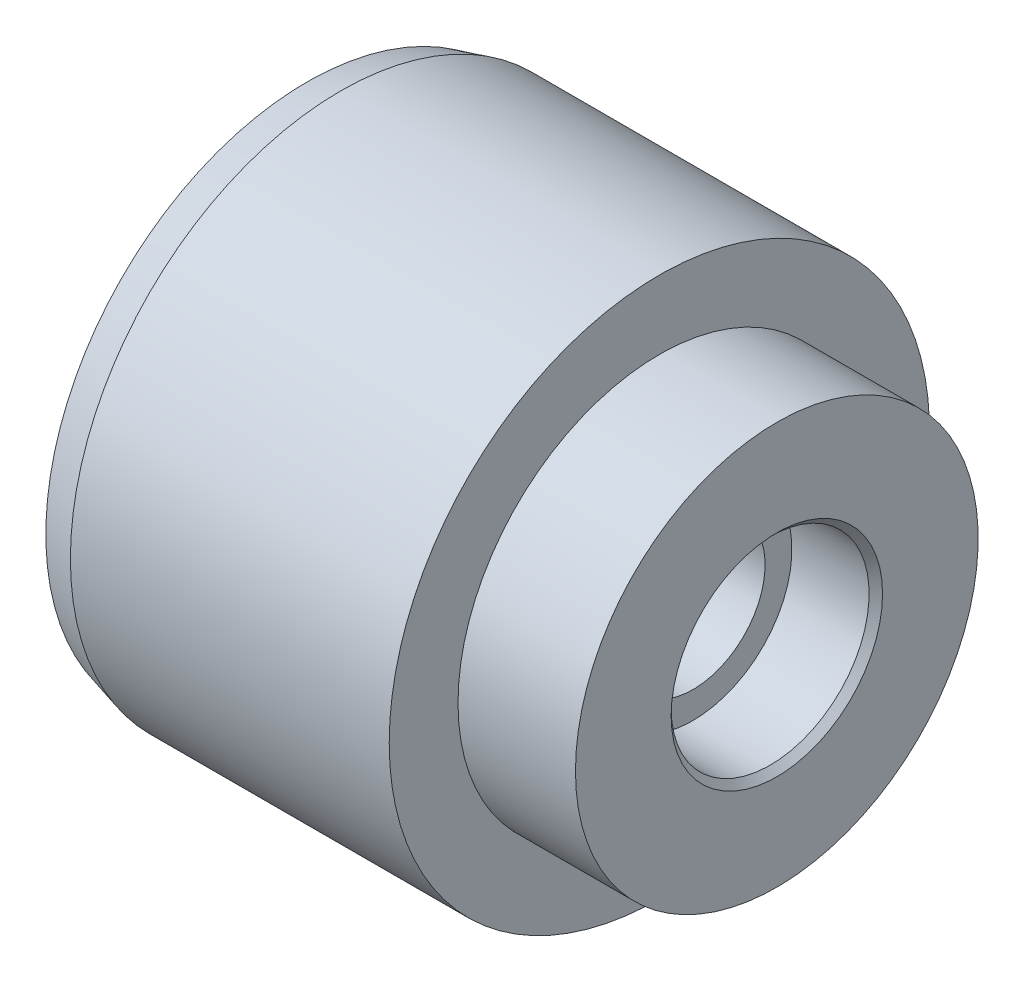
ISO-10303-21;
HEADER;
FILE_DESCRIPTION(('STEP AP214'),'2;1');
FILE_NAME('part.step','',(''),(''),'','','');
FILE_SCHEMA(('AUTOMOTIVE_DESIGN { 1 0 10303 214 1 1 1 1 }'));
ENDSEC;
DATA;
#1=APPLICATION_CONTEXT('core data for automotive mechanical design processes');
#2=APPLICATION_PROTOCOL_DEFINITION('international standard','automotive_design',2000,#1);
#3=PRODUCT_CONTEXT('',#1,'mechanical');
#4=PRODUCT('Part','Part','',(#3));
#5=PRODUCT_RELATED_PRODUCT_CATEGORY('part','',(#4));
#6=PRODUCT_DEFINITION_FORMATION('','',#4);
#7=PRODUCT_DEFINITION_CONTEXT('part definition',#1,'design');
#8=PRODUCT_DEFINITION('design','',#6,#7);
#9=PRODUCT_DEFINITION_SHAPE('','',#8);
#10=(LENGTH_UNIT() NAMED_UNIT(*) SI_UNIT(.MILLI.,.METRE.));
#11=(NAMED_UNIT(*) PLANE_ANGLE_UNIT() SI_UNIT($,.RADIAN.));
#12=(NAMED_UNIT(*) SI_UNIT($,.STERADIAN.) SOLID_ANGLE_UNIT());
#13=UNCERTAINTY_MEASURE_WITH_UNIT(LENGTH_MEASURE(1.E-05),#10,'distance_accuracy_value','');
#14=(GEOMETRIC_REPRESENTATION_CONTEXT(3) GLOBAL_UNCERTAINTY_ASSIGNED_CONTEXT((#13)) GLOBAL_UNIT_ASSIGNED_CONTEXT((#10,
#11,#12)) REPRESENTATION_CONTEXT('',''));
#15=CARTESIAN_POINT('',(0.,0.,0.));
#16=DIRECTION('',(0.,0.,1.));
#17=DIRECTION('',(1.,0.,0.));
#18=AXIS2_PLACEMENT_3D('',#15,#16,#17);
#19=CARTESIAN_POINT('',(0.,0.,0.));
#20=DIRECTION('',(1.,0.,0.));
#21=DIRECTION('',(0.,0.,-1.));
#22=AXIS2_PLACEMENT_3D('',#19,#20,#21);
#23=PLANE('',#22);
#24=CARTESIAN_POINT('',(0.,0.,0.));
#25=DIRECTION('',(-1.,0.,0.));
#26=DIRECTION('',(0.,0.,1.));
#27=AXIS2_PLACEMENT_3D('',#24,#25,#26);
#28=CIRCLE('',#27,2.15);
#29=CARTESIAN_POINT('',(0.,0.,2.15000000000001));
#30=VERTEX_POINT('',#29);
#31=EDGE_CURVE('E102',#30,#30,#28,.T.);
#32=ORIENTED_EDGE('',*,*,#31,.F.);
#33=EDGE_LOOP('',(#32));
#34=FACE_BOUND('',#33,.T.);
#35=CARTESIAN_POINT('',(0.,0.,0.));
#36=DIRECTION('',(1.,0.,0.));
#37=DIRECTION('',(0.,0.,-1.));
#38=AXIS2_PLACEMENT_3D('',#35,#36,#37);
#39=CIRCLE('',#38,7.78205080756886);
#40=CARTESIAN_POINT('',(0.,0.,-7.7820508075689));
#41=VERTEX_POINT('',#40);
#42=EDGE_CURVE('E71',#41,#41,#39,.F.);
#43=ORIENTED_EDGE('',*,*,#42,.T.);
#44=EDGE_LOOP('',(#43));
#45=FACE_BOUND('',#44,.T.);
#46=ADVANCED_FACE('F47',(#34,#45),#23,.F.);
#47=CARTESIAN_POINT('',(-5.88192419825073,0.,0.));
#48=DIRECTION('',(-1.,0.,0.));
#49=DIRECTION('',(0.,0.,1.));
#50=AXIS2_PLACEMENT_3D('',#47,#48,#49);
#51=CYLINDRICAL_SURFACE('',#50,8.05);
#52=CARTESIAN_POINT('',(1.00000000000011,0.,0.));
#53=DIRECTION('',(1.,0.,0.));
#54=DIRECTION('',(0.,0.,-1.));
#55=AXIS2_PLACEMENT_3D('',#52,#53,#54);
#56=CIRCLE('',#55,8.05);
#57=CARTESIAN_POINT('',(1.00000000000011,0.,-8.05000000000004));
#58=VERTEX_POINT('',#57);
#59=EDGE_CURVE('E64',#58,#58,#56,.T.);
#60=ORIENTED_EDGE('',*,*,#59,.T.);
#61=EDGE_LOOP('',(#60));
#62=FACE_BOUND('',#61,.T.);
#63=CARTESIAN_POINT('',(10.5,0.,2.77555756156289E-13));
#64=DIRECTION('',(-1.,0.,0.));
#65=DIRECTION('',(0.,0.,1.));
#66=AXIS2_PLACEMENT_3D('',#63,#64,#65);
#67=CIRCLE('',#66,8.05);
#68=CARTESIAN_POINT('',(10.5,0.,8.05000000000031));
#69=VERTEX_POINT('',#68);
#70=EDGE_CURVE('E93',#69,#69,#67,.T.);
#71=ORIENTED_EDGE('',*,*,#70,.T.);
#72=EDGE_LOOP('',(#71));
#73=FACE_BOUND('',#72,.T.);
#74=ADVANCED_FACE('F115',(#62,#73),#51,.T.);
#75=CARTESIAN_POINT('',(10.5,8.04999999999985,0.));
#76=DIRECTION('',(-1.,0.,0.));
#77=DIRECTION('',(0.,0.,1.));
#78=AXIS2_PLACEMENT_3D('',#75,#76,#77);
#79=PLANE('',#78);
#80=ORIENTED_EDGE('',*,*,#70,.F.);
#81=EDGE_LOOP('',(#80));
#82=FACE_BOUND('',#81,.T.);
#83=CARTESIAN_POINT('',(10.5,0.,2.77555756156289E-13));
#84=DIRECTION('',(-1.,0.,0.));
#85=DIRECTION('',(0.,0.,1.));
#86=AXIS2_PLACEMENT_3D('',#83,#84,#85);
#87=CIRCLE('',#86,6.);
#88=CARTESIAN_POINT('',(10.5,0.,6.0000000000003));
#89=VERTEX_POINT('',#88);
#90=EDGE_CURVE('E86',#89,#89,#87,.T.);
#91=ORIENTED_EDGE('',*,*,#90,.T.);
#92=EDGE_LOOP('',(#91));
#93=FACE_BOUND('',#92,.T.);
#94=ADVANCED_FACE('F160',(#82,#93),#79,.F.);
#95=CARTESIAN_POINT('',(-5.88192419825073,0.,0.));
#96=DIRECTION('',(-1.,0.,0.));
#97=DIRECTION('',(0.,0.,1.));
#98=AXIS2_PLACEMENT_3D('',#95,#96,#97);
#99=CYLINDRICAL_SURFACE('',#98,6.);
#100=ORIENTED_EDGE('',*,*,#90,.F.);
#101=EDGE_LOOP('',(#100));
#102=FACE_BOUND('',#101,.T.);
#103=CARTESIAN_POINT('',(14.,0.,2.77555756156289E-13));
#104=DIRECTION('',(-1.,0.,0.));
#105=DIRECTION('',(0.,0.,1.));
#106=AXIS2_PLACEMENT_3D('',#103,#104,#105);
#107=CIRCLE('',#106,6.);
#108=CARTESIAN_POINT('',(14.,0.,6.0000000000003));
#109=VERTEX_POINT('',#108);
#110=EDGE_CURVE('E81',#109,#109,#107,.T.);
#111=ORIENTED_EDGE('',*,*,#110,.T.);
#112=EDGE_LOOP('',(#111));
#113=FACE_BOUND('',#112,.T.);
#114=ADVANCED_FACE('F157',(#102,#113),#99,.T.);
#115=CARTESIAN_POINT('',(14.,2.95000000000001,0.));
#116=DIRECTION('',(-1.,0.,0.));
#117=DIRECTION('',(0.,0.,1.));
#118=AXIS2_PLACEMENT_3D('',#115,#116,#117);
#119=PLANE('',#118);
#120=CARTESIAN_POINT('',(14.,0.,2.77555756156289E-13));
#121=DIRECTION('',(-1.,0.,0.));
#122=DIRECTION('',(0.,0.,1.));
#123=AXIS2_PLACEMENT_3D('',#120,#121,#122);
#124=CIRCLE('',#123,3.15);
#125=CARTESIAN_POINT('',(14.,0.,3.1500000000003));
#126=VERTEX_POINT('',#125);
#127=EDGE_CURVE('E56',#126,#126,#124,.T.);
#128=ORIENTED_EDGE('',*,*,#127,.T.);
#129=EDGE_LOOP('',(#128));
#130=FACE_BOUND('',#129,.T.);
#131=ORIENTED_EDGE('',*,*,#110,.F.);
#132=EDGE_LOOP('',(#131));
#133=FACE_BOUND('',#132,.T.);
#134=ADVANCED_FACE('F143',(#130,#133),#119,.F.);
#135=CARTESIAN_POINT('',(-5.88192419825073,0.,0.));
#136=DIRECTION('',(-1.,0.,0.));
#137=DIRECTION('',(0.,0.,1.));
#138=AXIS2_PLACEMENT_3D('',#135,#136,#137);
#139=CYLINDRICAL_SURFACE('',#138,2.95);
#140=CARTESIAN_POINT('',(13.8,0.,2.77555756156289E-13));
#141=DIRECTION('',(-1.,0.,0.));
#142=DIRECTION('',(0.,0.,1.));
#143=AXIS2_PLACEMENT_3D('',#140,#141,#142);
#144=CIRCLE('',#143,2.95);
#145=CARTESIAN_POINT('',(13.8,0.,2.95000000000029));
#146=VERTEX_POINT('',#145);
#147=EDGE_CURVE('E11',#146,#146,#144,.F.);
#148=ORIENTED_EDGE('',*,*,#147,.T.);
#149=EDGE_LOOP('',(#148));
#150=FACE_BOUND('',#149,.T.);
#151=CARTESIAN_POINT('',(11.5,0.,2.77555756156289E-13));
#152=DIRECTION('',(-1.,0.,0.));
#153=DIRECTION('',(0.,0.,1.));
#154=AXIS2_PLACEMENT_3D('',#151,#152,#153);
#155=CIRCLE('',#154,2.95);
#156=CARTESIAN_POINT('',(11.5,0.,2.95000000000029));
#157=VERTEX_POINT('',#156);
#158=EDGE_CURVE('E87',#157,#157,#155,.T.);
#159=ORIENTED_EDGE('',*,*,#158,.T.);
#160=EDGE_LOOP('',(#159));
#161=FACE_BOUND('',#160,.T.);
#162=ADVANCED_FACE('F131',(#150,#161),#139,.F.);
#163=CARTESIAN_POINT('',(11.5,2.94999999999999,0.));
#164=DIRECTION('',(-1.,0.,0.));
#165=DIRECTION('',(0.,0.,1.));
#166=AXIS2_PLACEMENT_3D('',#163,#164,#165);
#167=PLANE('',#166);
#168=CARTESIAN_POINT('',(11.5,0.,2.77555756156289E-13));
#169=DIRECTION('',(-1.,0.,0.));
#170=DIRECTION('',(0.,0.,1.));
#171=AXIS2_PLACEMENT_3D('',#168,#169,#170);
#172=CIRCLE('',#171,2.15);
#173=CARTESIAN_POINT('',(11.5,0.,2.15000000000028));
#174=VERTEX_POINT('',#173);
#175=EDGE_CURVE('E99',#174,#174,#172,.T.);
#176=ORIENTED_EDGE('',*,*,#175,.T.);
#177=EDGE_LOOP('',(#176));
#178=FACE_BOUND('',#177,.T.);
#179=ORIENTED_EDGE('',*,*,#158,.F.);
#180=EDGE_LOOP('',(#179));
#181=FACE_BOUND('',#180,.T.);
#182=ADVANCED_FACE('F133',(#178,#181),#167,.F.);
#183=CARTESIAN_POINT('',(0.,0.,0.));
#184=DIRECTION('',(1.,0.,0.));
#185=DIRECTION('',(0.,0.,-1.));
#186=AXIS2_PLACEMENT_3D('',#183,#184,#185);
#187=CONICAL_SURFACE('',#186,7.78205080756886,0.261799387799147);
#188=ORIENTED_EDGE('',*,*,#59,.F.);
#189=EDGE_LOOP('',(#188));
#190=FACE_BOUND('',#189,.T.);
#191=ORIENTED_EDGE('',*,*,#42,.F.);
#192=EDGE_LOOP('',(#191));
#193=FACE_BOUND('',#192,.T.);
#194=ADVANCED_FACE('F135',(#190,#193),#187,.T.);
#195=CARTESIAN_POINT('',(14.,0.,2.77555756156289E-13));
#196=DIRECTION('',(1.,0.,0.));
#197=DIRECTION('',(0.,0.,-1.));
#198=AXIS2_PLACEMENT_3D('',#195,#196,#197);
#199=CONICAL_SURFACE('',#198,3.15,0.785398163397449);
#200=ORIENTED_EDGE('',*,*,#147,.F.);
#201=EDGE_LOOP('',(#200));
#202=FACE_BOUND('',#201,.T.);
#203=ORIENTED_EDGE('',*,*,#127,.F.);
#204=EDGE_LOOP('',(#203));
#205=FACE_BOUND('',#204,.T.);
#206=ADVANCED_FACE('F50',(#202,#205),#199,.F.);
#207=CARTESIAN_POINT('',(0.,0.,0.));
#208=DIRECTION('',(-1.,0.,0.));
#209=DIRECTION('',(0.,0.,1.));
#210=AXIS2_PLACEMENT_3D('',#207,#208,#209);
#211=CYLINDRICAL_SURFACE('',#210,2.15);
#212=ORIENTED_EDGE('',*,*,#31,.T.);
#213=EDGE_LOOP('',(#212));
#214=FACE_BOUND('',#213,.T.);
#215=ORIENTED_EDGE('',*,*,#175,.F.);
#216=EDGE_LOOP('',(#215));
#217=FACE_BOUND('',#216,.T.);
#218=ADVANCED_FACE('F110',(#214,#217),#211,.F.);
#219=CLOSED_SHELL('',(#46,#74,#94,#114,#134,#162,#182,#194,#206,#218));
#220=MANIFOLD_SOLID_BREP('B2',#219);
#221=ADVANCED_BREP_SHAPE_REPRESENTATION('',(#18,#220),#14);
#222=SHAPE_DEFINITION_REPRESENTATION(#9,#221);
ENDSEC;
END-ISO-10303-21;
